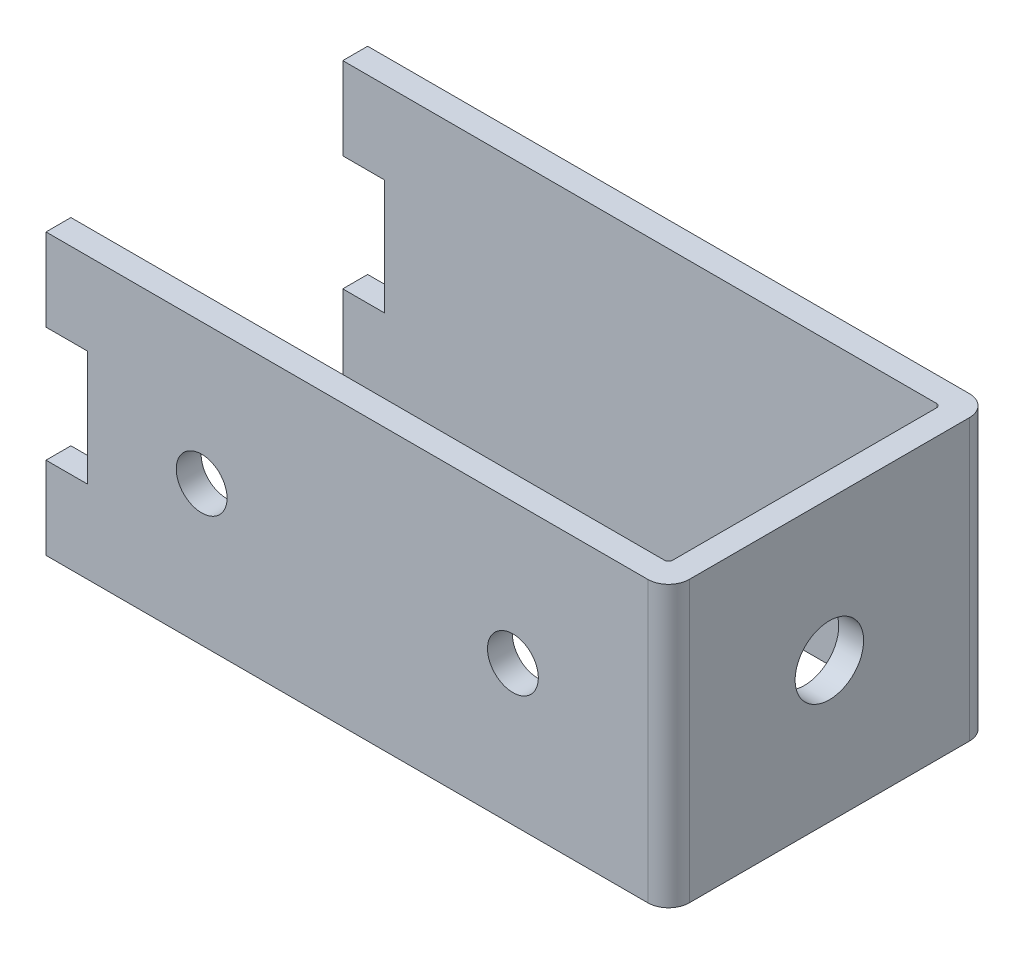
ISO-10303-21;
HEADER;
FILE_DESCRIPTION(('STEP AP214'),'2;1');
FILE_NAME('part.step','',(''),(''),'','','');
FILE_SCHEMA(('AUTOMOTIVE_DESIGN { 1 0 10303 214 1 1 1 1 }'));
ENDSEC;
DATA;
#1=APPLICATION_CONTEXT('core data for automotive mechanical design processes');
#2=APPLICATION_PROTOCOL_DEFINITION('international standard','automotive_design',2000,#1);
#3=PRODUCT_CONTEXT('',#1,'mechanical');
#4=PRODUCT('Part','Part','',(#3));
#5=PRODUCT_RELATED_PRODUCT_CATEGORY('part','',(#4));
#6=PRODUCT_DEFINITION_FORMATION('','',#4);
#7=PRODUCT_DEFINITION_CONTEXT('part definition',#1,'design');
#8=PRODUCT_DEFINITION('design','',#6,#7);
#9=PRODUCT_DEFINITION_SHAPE('','',#8);
#10=(LENGTH_UNIT() NAMED_UNIT(*) SI_UNIT(.MILLI.,.METRE.));
#11=(NAMED_UNIT(*) PLANE_ANGLE_UNIT() SI_UNIT($,.RADIAN.));
#12=(NAMED_UNIT(*) SI_UNIT($,.STERADIAN.) SOLID_ANGLE_UNIT());
#13=UNCERTAINTY_MEASURE_WITH_UNIT(LENGTH_MEASURE(1.E-05),#10,'distance_accuracy_value','');
#14=(GEOMETRIC_REPRESENTATION_CONTEXT(3) GLOBAL_UNCERTAINTY_ASSIGNED_CONTEXT((#13)) GLOBAL_UNIT_ASSIGNED_CONTEXT((#10,
#11,#12)) REPRESENTATION_CONTEXT('',''));
#15=CARTESIAN_POINT('',(0.,0.,0.));
#16=DIRECTION('',(0.,0.,1.));
#17=DIRECTION('',(1.,0.,0.));
#18=AXIS2_PLACEMENT_3D('',#15,#16,#17);
#19=CARTESIAN_POINT('',(-15.,6.75,-7.75));
#20=DIRECTION('',(1.,0.,0.));
#21=DIRECTION('',(0.,0.,-1.));
#22=AXIS2_PLACEMENT_3D('',#19,#20,#21);
#23=PLANE('',#22);
#24=DIRECTION('',(0.,-1.,0.));
#25=VECTOR('',#24,1.);
#26=CARTESIAN_POINT('',(-15.,6.75,-7.75));
#27=LINE('',#26,#25);
#28=CARTESIAN_POINT('',(-15.,6.75,-7.75));
#29=VERTEX_POINT('',#28);
#30=CARTESIAN_POINT('',(-15.,2.775,-7.75));
#31=VERTEX_POINT('',#30);
#32=EDGE_CURVE('E206',#29,#31,#27,.T.);
#33=ORIENTED_EDGE('',*,*,#32,.T.);
#34=DIRECTION('',(0.,0.,1.));
#35=VECTOR('',#34,1.);
#36=CARTESIAN_POINT('',(-15.,2.775,-7.75));
#37=LINE('',#36,#35);
#38=CARTESIAN_POINT('',(-15.,2.775,-6.55));
#39=VERTEX_POINT('',#38);
#40=EDGE_CURVE('E293',#31,#39,#37,.T.);
#41=ORIENTED_EDGE('',*,*,#40,.T.);
#42=DIRECTION('',(0.,1.,0.));
#43=VECTOR('',#42,1.);
#44=CARTESIAN_POINT('',(-15.,-6.75,-6.55));
#45=LINE('',#44,#43);
#46=CARTESIAN_POINT('',(-15.,6.75,-6.55));
#47=VERTEX_POINT('',#46);
#48=EDGE_CURVE('E343',#39,#47,#45,.T.);
#49=ORIENTED_EDGE('',*,*,#48,.T.);
#50=DIRECTION('',(0.,0.,1.));
#51=VECTOR('',#50,1.);
#52=CARTESIAN_POINT('',(-15.,6.75,-7.75));
#53=LINE('',#52,#51);
#54=EDGE_CURVE('E347',#29,#47,#53,.T.);
#55=ORIENTED_EDGE('',*,*,#54,.F.);
#56=EDGE_LOOP('',(#33,#41,#49,#55));
#57=FACE_BOUND('',#56,.T.);
#58=ADVANCED_FACE('F38',(#57),#23,.F.);
#59=DIRECTION('',(0.,1.,0.));
#60=VECTOR('',#59,1.);
#61=CARTESIAN_POINT('',(-15.,-6.75,6.55));
#62=LINE('',#61,#60);
#63=CARTESIAN_POINT('',(-15.,2.775,6.55));
#64=VERTEX_POINT('',#63);
#65=CARTESIAN_POINT('',(-15.,6.75,6.55));
#66=VERTEX_POINT('',#65);
#67=EDGE_CURVE('E338',#64,#66,#62,.T.);
#68=ORIENTED_EDGE('',*,*,#67,.F.);
#69=CARTESIAN_POINT('',(-15.,2.775,7.75));
#70=VERTEX_POINT('',#69);
#71=EDGE_CURVE('E289',#64,#70,#37,.T.);
#72=ORIENTED_EDGE('',*,*,#71,.T.);
#73=DIRECTION('',(0.,-1.,0.));
#74=VECTOR('',#73,1.);
#75=CARTESIAN_POINT('',(-15.,6.75,7.75));
#76=LINE('',#75,#74);
#77=CARTESIAN_POINT('',(-15.,6.75,7.75));
#78=VERTEX_POINT('',#77);
#79=EDGE_CURVE('E205',#78,#70,#76,.T.);
#80=ORIENTED_EDGE('',*,*,#79,.F.);
#81=EDGE_CURVE('E352',#66,#78,#53,.T.);
#82=ORIENTED_EDGE('',*,*,#81,.F.);
#83=EDGE_LOOP('',(#68,#72,#80,#82));
#84=FACE_BOUND('',#83,.T.);
#85=ADVANCED_FACE('F389',(#84),#23,.F.);
#86=CARTESIAN_POINT('',(-15.,-6.75,-6.55));
#87=VERTEX_POINT('',#86);
#88=CARTESIAN_POINT('',(-15.,-2.775,-6.55));
#89=VERTEX_POINT('',#88);
#90=EDGE_CURVE('E339',#87,#89,#45,.T.);
#91=ORIENTED_EDGE('',*,*,#90,.T.);
#92=DIRECTION('',(0.,0.,1.));
#93=VECTOR('',#92,1.);
#94=CARTESIAN_POINT('',(-15.,-2.775,-7.75));
#95=LINE('',#94,#93);
#96=CARTESIAN_POINT('',(-15.,-2.775,-7.75));
#97=VERTEX_POINT('',#96);
#98=EDGE_CURVE('E54',#97,#89,#95,.T.);
#99=ORIENTED_EDGE('',*,*,#98,.F.);
#100=CARTESIAN_POINT('',(-15.,-6.75,-7.75));
#101=VERTEX_POINT('',#100);
#102=EDGE_CURVE('E214',#97,#101,#27,.T.);
#103=ORIENTED_EDGE('',*,*,#102,.T.);
#104=DIRECTION('',(0.,0.,1.));
#105=VECTOR('',#104,1.);
#106=CARTESIAN_POINT('',(-15.,-6.75,-7.75));
#107=LINE('',#106,#105);
#108=EDGE_CURVE('E362',#101,#87,#107,.T.);
#109=ORIENTED_EDGE('',*,*,#108,.T.);
#110=EDGE_LOOP('',(#91,#99,#103,#109));
#111=FACE_BOUND('',#110,.T.);
#112=ADVANCED_FACE('F444',(#111),#23,.F.);
#113=CARTESIAN_POINT('',(-15.,-2.775,7.75));
#114=VERTEX_POINT('',#113);
#115=CARTESIAN_POINT('',(-15.,-6.75,7.75));
#116=VERTEX_POINT('',#115);
#117=EDGE_CURVE('E192',#114,#116,#76,.T.);
#118=ORIENTED_EDGE('',*,*,#117,.F.);
#119=CARTESIAN_POINT('',(-15.,-2.775,6.55));
#120=VERTEX_POINT('',#119);
#121=EDGE_CURVE('E174',#120,#114,#95,.T.);
#122=ORIENTED_EDGE('',*,*,#121,.F.);
#123=CARTESIAN_POINT('',(-15.,-6.75,6.55));
#124=VERTEX_POINT('',#123);
#125=EDGE_CURVE('E344',#124,#120,#62,.T.);
#126=ORIENTED_EDGE('',*,*,#125,.F.);
#127=EDGE_CURVE('E202',#124,#116,#107,.T.);
#128=ORIENTED_EDGE('',*,*,#127,.T.);
#129=EDGE_LOOP('',(#118,#122,#126,#128));
#130=FACE_BOUND('',#129,.T.);
#131=ADVANCED_FACE('F200',(#130),#23,.F.);
#132=CARTESIAN_POINT('',(-15.,6.75,7.75));
#133=DIRECTION('',(0.,0.,-1.));
#134=DIRECTION('',(-1.,0.,0.));
#135=AXIS2_PLACEMENT_3D('',#132,#133,#134);
#136=PLANE('',#135);
#137=CARTESIAN_POINT('',(7.50000000000001,0.,7.75));
#138=DIRECTION('',(0.,0.,1.));
#139=DIRECTION('',(1.,0.,0.));
#140=AXIS2_PLACEMENT_3D('',#137,#138,#139);
#141=CIRCLE('',#140,1.225);
#142=CARTESIAN_POINT('',(8.725,0.,7.75));
#143=VERTEX_POINT('',#142);
#144=EDGE_CURVE('E410',#143,#143,#141,.T.);
#145=ORIENTED_EDGE('',*,*,#144,.F.);
#146=EDGE_LOOP('',(#145));
#147=FACE_BOUND('',#146,.T.);
#148=CARTESIAN_POINT('',(-7.49999999999999,0.,7.75));
#149=DIRECTION('',(0.,0.,1.));
#150=DIRECTION('',(1.,0.,0.));
#151=AXIS2_PLACEMENT_3D('',#148,#149,#150);
#152=CIRCLE('',#151,1.225);
#153=CARTESIAN_POINT('',(-6.27499999999999,0.,7.75));
#154=VERTEX_POINT('',#153);
#155=EDGE_CURVE('E198',#154,#154,#152,.T.);
#156=ORIENTED_EDGE('',*,*,#155,.F.);
#157=EDGE_LOOP('',(#156));
#158=FACE_BOUND('',#157,.T.);
#159=ORIENTED_EDGE('',*,*,#79,.T.);
#160=DIRECTION('',(-1.,0.,0.));
#161=VECTOR('',#160,1.);
#162=CARTESIAN_POINT('',(-15.,2.775,7.75));
#163=LINE('',#162,#161);
#164=CARTESIAN_POINT('',(-13.,2.775,7.75));
#165=VERTEX_POINT('',#164);
#166=EDGE_CURVE('E406',#165,#70,#163,.T.);
#167=ORIENTED_EDGE('',*,*,#166,.F.);
#168=DIRECTION('',(0.,1.,0.));
#169=VECTOR('',#168,1.);
#170=CARTESIAN_POINT('',(-13.,2.775,7.75));
#171=LINE('',#170,#169);
#172=CARTESIAN_POINT('',(-13.,-2.775,7.75));
#173=VERTEX_POINT('',#172);
#174=EDGE_CURVE('E196',#173,#165,#171,.T.);
#175=ORIENTED_EDGE('',*,*,#174,.F.);
#176=DIRECTION('',(1.,0.,0.));
#177=VECTOR('',#176,1.);
#178=CARTESIAN_POINT('',(-15.,-2.775,7.75));
#179=LINE('',#178,#177);
#180=EDGE_CURVE('E177',#114,#173,#179,.T.);
#181=ORIENTED_EDGE('',*,*,#180,.F.);
#182=ORIENTED_EDGE('',*,*,#117,.T.);
#183=DIRECTION('',(1.,0.,0.));
#184=VECTOR('',#183,1.);
#185=CARTESIAN_POINT('',(-15.,-6.75,7.75));
#186=LINE('',#185,#184);
#187=CARTESIAN_POINT('',(14.,-6.75,7.75));
#188=VERTEX_POINT('',#187);
#189=EDGE_CURVE('E366',#116,#188,#186,.T.);
#190=ORIENTED_EDGE('',*,*,#189,.T.);
#191=DIRECTION('',(0.,-1.,0.));
#192=VECTOR('',#191,1.);
#193=CARTESIAN_POINT('',(14.,6.75,7.75));
#194=LINE('',#193,#192);
#195=CARTESIAN_POINT('',(14.,6.75,7.75));
#196=VERTEX_POINT('',#195);
#197=EDGE_CURVE('E230',#188,#196,#194,.F.);
#198=ORIENTED_EDGE('',*,*,#197,.T.);
#199=DIRECTION('',(1.,0.,0.));
#200=VECTOR('',#199,1.);
#201=CARTESIAN_POINT('',(-15.,6.75,7.75));
#202=LINE('',#201,#200);
#203=EDGE_CURVE('E351',#78,#196,#202,.T.);
#204=ORIENTED_EDGE('',*,*,#203,.F.);
#205=EDGE_LOOP('',(#159,#167,#175,#181,#182,#190,#198,#204));
#206=FACE_BOUND('',#205,.T.);
#207=ADVANCED_FACE('F190',(#147,#158,#206),#136,.F.);
#208=CARTESIAN_POINT('',(15.,6.75,-7.75));
#209=DIRECTION('',(-1.,0.,0.));
#210=DIRECTION('',(0.,0.,1.));
#211=AXIS2_PLACEMENT_3D('',#208,#209,#210);
#212=PLANE('',#211);
#213=CARTESIAN_POINT('',(15.,0.,0.));
#214=DIRECTION('',(1.,0.,0.));
#215=DIRECTION('',(0.,0.,-1.));
#216=AXIS2_PLACEMENT_3D('',#213,#214,#215);
#217=CIRCLE('',#216,1.65);
#218=CARTESIAN_POINT('',(15.,0.,-1.65));
#219=VERTEX_POINT('',#218);
#220=EDGE_CURVE('E308',#219,#219,#217,.T.);
#221=ORIENTED_EDGE('',*,*,#220,.F.);
#222=EDGE_LOOP('',(#221));
#223=FACE_BOUND('',#222,.T.);
#224=DIRECTION('',(0.,0.,-1.));
#225=VECTOR('',#224,1.);
#226=CARTESIAN_POINT('',(15.,6.75,-7.75));
#227=LINE('',#226,#225);
#228=CARTESIAN_POINT('',(15.,6.75,6.75));
#229=VERTEX_POINT('',#228);
#230=CARTESIAN_POINT('',(15.,6.75,-6.75));
#231=VERTEX_POINT('',#230);
#232=EDGE_CURVE('E356',#229,#231,#227,.T.);
#233=ORIENTED_EDGE('',*,*,#232,.F.);
#234=DIRECTION('',(0.,-1.,0.));
#235=VECTOR('',#234,1.);
#236=CARTESIAN_POINT('',(15.,6.75,6.75));
#237=LINE('',#236,#235);
#238=CARTESIAN_POINT('',(15.,-6.75,6.75));
#239=VERTEX_POINT('',#238);
#240=EDGE_CURVE('E220',#229,#239,#237,.T.);
#241=ORIENTED_EDGE('',*,*,#240,.T.);
#242=DIRECTION('',(0.,0.,-1.));
#243=VECTOR('',#242,1.);
#244=CARTESIAN_POINT('',(15.,-6.75,-7.75));
#245=LINE('',#244,#243);
#246=CARTESIAN_POINT('',(15.,-6.75,-6.75));
#247=VERTEX_POINT('',#246);
#248=EDGE_CURVE('E368',#239,#247,#245,.T.);
#249=ORIENTED_EDGE('',*,*,#248,.T.);
#250=DIRECTION('',(0.,-1.,0.));
#251=VECTOR('',#250,1.);
#252=CARTESIAN_POINT('',(15.,6.75,-6.75));
#253=LINE('',#252,#251);
#254=EDGE_CURVE('E211',#247,#231,#253,.F.);
#255=ORIENTED_EDGE('',*,*,#254,.T.);
#256=EDGE_LOOP('',(#233,#241,#249,#255));
#257=FACE_BOUND('',#256,.T.);
#258=ADVANCED_FACE('F468',(#223,#257),#212,.F.);
#259=CARTESIAN_POINT('',(-15.,6.75,-7.75));
#260=DIRECTION('',(0.,0.,1.));
#261=DIRECTION('',(1.,0.,0.));
#262=AXIS2_PLACEMENT_3D('',#259,#260,#261);
#263=PLANE('',#262);
#264=DIRECTION('',(0.,1.,0.));
#265=VECTOR('',#264,1.);
#266=CARTESIAN_POINT('',(-13.,2.775,-7.75));
#267=LINE('',#266,#265);
#268=CARTESIAN_POINT('',(-13.,-2.775,-7.75));
#269=VERTEX_POINT('',#268);
#270=CARTESIAN_POINT('',(-13.,2.775,-7.75));
#271=VERTEX_POINT('',#270);
#272=EDGE_CURVE('E431',#269,#271,#267,.T.);
#273=ORIENTED_EDGE('',*,*,#272,.T.);
#274=DIRECTION('',(-1.,0.,0.));
#275=VECTOR('',#274,1.);
#276=CARTESIAN_POINT('',(-15.,2.775,-7.75));
#277=LINE('',#276,#275);
#278=EDGE_CURVE('E186',#271,#31,#277,.T.);
#279=ORIENTED_EDGE('',*,*,#278,.T.);
#280=ORIENTED_EDGE('',*,*,#32,.F.);
#281=DIRECTION('',(-1.,0.,0.));
#282=VECTOR('',#281,1.);
#283=CARTESIAN_POINT('',(-15.,6.75,-7.75));
#284=LINE('',#283,#282);
#285=CARTESIAN_POINT('',(14.,6.75,-7.75));
#286=VERTEX_POINT('',#285);
#287=EDGE_CURVE('E359',#286,#29,#284,.T.);
#288=ORIENTED_EDGE('',*,*,#287,.F.);
#289=DIRECTION('',(0.,-1.,0.));
#290=VECTOR('',#289,1.);
#291=CARTESIAN_POINT('',(14.,6.75,-7.75));
#292=LINE('',#291,#290);
#293=CARTESIAN_POINT('',(14.,-6.75,-7.75));
#294=VERTEX_POINT('',#293);
#295=EDGE_CURVE('E239',#286,#294,#292,.T.);
#296=ORIENTED_EDGE('',*,*,#295,.T.);
#297=DIRECTION('',(-1.,0.,0.));
#298=VECTOR('',#297,1.);
#299=CARTESIAN_POINT('',(-15.,-6.75,-7.75));
#300=LINE('',#299,#298);
#301=EDGE_CURVE('E371',#294,#101,#300,.T.);
#302=ORIENTED_EDGE('',*,*,#301,.T.);
#303=ORIENTED_EDGE('',*,*,#102,.F.);
#304=DIRECTION('',(1.,0.,0.));
#305=VECTOR('',#304,1.);
#306=CARTESIAN_POINT('',(-15.,-2.775,-7.75));
#307=LINE('',#306,#305);
#308=EDGE_CURVE('E427',#97,#269,#307,.T.);
#309=ORIENTED_EDGE('',*,*,#308,.T.);
#310=EDGE_LOOP('',(#273,#279,#280,#288,#296,#302,#303,#309));
#311=FACE_BOUND('',#310,.T.);
#312=ADVANCED_FACE('F435',(#311),#263,.F.);
#313=CARTESIAN_POINT('',(0.,6.75,0.));
#314=DIRECTION('',(0.,1.,0.));
#315=DIRECTION('',(0.,0.,1.));
#316=AXIS2_PLACEMENT_3D('',#313,#314,#315);
#317=PLANE('',#316);
#318=ORIENTED_EDGE('',*,*,#203,.T.);
#319=CARTESIAN_POINT('',(14.,6.75,6.75));
#320=DIRECTION('',(0.,1.,0.));
#321=DIRECTION('',(0.,0.,1.));
#322=AXIS2_PLACEMENT_3D('',#319,#320,#321);
#323=CIRCLE('',#322,1.);
#324=EDGE_CURVE('E236',#196,#229,#323,.T.);
#325=ORIENTED_EDGE('',*,*,#324,.T.);
#326=ORIENTED_EDGE('',*,*,#232,.T.);
#327=CARTESIAN_POINT('',(14.,6.75,-6.75));
#328=DIRECTION('',(0.,1.,0.));
#329=DIRECTION('',(0.,0.,1.));
#330=AXIS2_PLACEMENT_3D('',#327,#328,#329);
#331=CIRCLE('',#330,1.);
#332=EDGE_CURVE('E233',#231,#286,#331,.T.);
#333=ORIENTED_EDGE('',*,*,#332,.T.);
#334=ORIENTED_EDGE('',*,*,#287,.T.);
#335=ORIENTED_EDGE('',*,*,#54,.T.);
#336=DIRECTION('',(-1.,0.,0.));
#337=VECTOR('',#336,1.);
#338=CARTESIAN_POINT('',(-15.,6.75,-6.55));
#339=LINE('',#338,#337);
#340=CARTESIAN_POINT('',(13.6,6.75,-6.55));
#341=VERTEX_POINT('',#340);
#342=EDGE_CURVE('E323',#341,#47,#339,.T.);
#343=ORIENTED_EDGE('',*,*,#342,.F.);
#344=CARTESIAN_POINT('',(13.6,6.75,-6.35));
#345=DIRECTION('',(0.,1.,0.));
#346=DIRECTION('',(0.,0.,1.));
#347=AXIS2_PLACEMENT_3D('',#344,#345,#346);
#348=CIRCLE('',#347,0.2);
#349=CARTESIAN_POINT('',(13.8,6.75,-6.35));
#350=VERTEX_POINT('',#349);
#351=EDGE_CURVE('E263',#341,#350,#348,.F.);
#352=ORIENTED_EDGE('',*,*,#351,.T.);
#353=DIRECTION('',(0.,0.,-1.));
#354=VECTOR('',#353,1.);
#355=CARTESIAN_POINT('',(13.8,6.75,6.54999999999999));
#356=LINE('',#355,#354);
#357=CARTESIAN_POINT('',(13.8,6.75,6.34999999999999));
#358=VERTEX_POINT('',#357);
#359=EDGE_CURVE('E319',#358,#350,#356,.T.);
#360=ORIENTED_EDGE('',*,*,#359,.F.);
#361=CARTESIAN_POINT('',(13.6,6.75,6.34999999999999));
#362=DIRECTION('',(0.,1.,0.));
#363=DIRECTION('',(0.,0.,1.));
#364=AXIS2_PLACEMENT_3D('',#361,#362,#363);
#365=CIRCLE('',#364,0.2);
#366=CARTESIAN_POINT('',(13.6,6.75,6.54999999999999));
#367=VERTEX_POINT('',#366);
#368=EDGE_CURVE('E257',#358,#367,#365,.F.);
#369=ORIENTED_EDGE('',*,*,#368,.T.);
#370=DIRECTION('',(1.,0.,0.));
#371=VECTOR('',#370,1.);
#372=CARTESIAN_POINT('',(-15.,6.75,6.55));
#373=LINE('',#372,#371);
#374=EDGE_CURVE('E316',#66,#367,#373,.T.);
#375=ORIENTED_EDGE('',*,*,#374,.F.);
#376=ORIENTED_EDGE('',*,*,#81,.T.);
#377=EDGE_LOOP('',(#318,#325,#326,#333,#334,#335,#343,#352,#360,#369,#375,#376));
#378=FACE_BOUND('',#377,.T.);
#379=ADVANCED_FACE('F383',(#378),#317,.T.);
#380=CARTESIAN_POINT('',(0.,-6.75,0.));
#381=DIRECTION('',(0.,1.,0.));
#382=DIRECTION('',(0.,0.,1.));
#383=AXIS2_PLACEMENT_3D('',#380,#381,#382);
#384=PLANE('',#383);
#385=ORIENTED_EDGE('',*,*,#248,.F.);
#386=CARTESIAN_POINT('',(14.,-6.75,6.75));
#387=DIRECTION('',(0.,1.,0.));
#388=DIRECTION('',(0.,0.,1.));
#389=AXIS2_PLACEMENT_3D('',#386,#387,#388);
#390=CIRCLE('',#389,1.);
#391=EDGE_CURVE('E227',#239,#188,#390,.F.);
#392=ORIENTED_EDGE('',*,*,#391,.T.);
#393=ORIENTED_EDGE('',*,*,#189,.F.);
#394=ORIENTED_EDGE('',*,*,#127,.F.);
#395=DIRECTION('',(1.,0.,0.));
#396=VECTOR('',#395,1.);
#397=CARTESIAN_POINT('',(-15.,-6.75,6.55));
#398=LINE('',#397,#396);
#399=CARTESIAN_POINT('',(13.6,-6.75,6.54999999999999));
#400=VERTEX_POINT('',#399);
#401=EDGE_CURVE('E327',#124,#400,#398,.T.);
#402=ORIENTED_EDGE('',*,*,#401,.T.);
#403=CARTESIAN_POINT('',(13.6,-6.75,6.34999999999999));
#404=DIRECTION('',(0.,1.,0.));
#405=DIRECTION('',(0.,0.,1.));
#406=AXIS2_PLACEMENT_3D('',#403,#404,#405);
#407=CIRCLE('',#406,0.2);
#408=CARTESIAN_POINT('',(13.8,-6.75,6.34999999999999));
#409=VERTEX_POINT('',#408);
#410=EDGE_CURVE('E260',#400,#409,#407,.T.);
#411=ORIENTED_EDGE('',*,*,#410,.T.);
#412=DIRECTION('',(0.,0.,-1.));
#413=VECTOR('',#412,1.);
#414=CARTESIAN_POINT('',(13.8,-6.75,6.54999999999999));
#415=LINE('',#414,#413);
#416=CARTESIAN_POINT('',(13.8,-6.75,-6.35));
#417=VERTEX_POINT('',#416);
#418=EDGE_CURVE('E331',#409,#417,#415,.T.);
#419=ORIENTED_EDGE('',*,*,#418,.T.);
#420=CARTESIAN_POINT('',(13.6,-6.75,-6.35));
#421=DIRECTION('',(0.,1.,0.));
#422=DIRECTION('',(0.,0.,1.));
#423=AXIS2_PLACEMENT_3D('',#420,#421,#422);
#424=CIRCLE('',#423,0.2);
#425=CARTESIAN_POINT('',(13.6,-6.75,-6.55));
#426=VERTEX_POINT('',#425);
#427=EDGE_CURVE('E266',#417,#426,#424,.T.);
#428=ORIENTED_EDGE('',*,*,#427,.T.);
#429=DIRECTION('',(-1.,0.,0.));
#430=VECTOR('',#429,1.);
#431=CARTESIAN_POINT('',(-15.,-6.75,-6.55));
#432=LINE('',#431,#430);
#433=EDGE_CURVE('E335',#426,#87,#432,.T.);
#434=ORIENTED_EDGE('',*,*,#433,.T.);
#435=ORIENTED_EDGE('',*,*,#108,.F.);
#436=ORIENTED_EDGE('',*,*,#301,.F.);
#437=CARTESIAN_POINT('',(14.,-6.75,-6.75));
#438=DIRECTION('',(0.,1.,0.));
#439=DIRECTION('',(0.,0.,1.));
#440=AXIS2_PLACEMENT_3D('',#437,#438,#439);
#441=CIRCLE('',#440,1.);
#442=EDGE_CURVE('E224',#294,#247,#441,.F.);
#443=ORIENTED_EDGE('',*,*,#442,.T.);
#444=EDGE_LOOP('',(#385,#392,#393,#394,#402,#411,#419,#428,#434,#435,#436,#443));
#445=FACE_BOUND('',#444,.T.);
#446=ADVANCED_FACE('F447',(#445),#384,.F.);
#447=CARTESIAN_POINT('',(-15.,-6.75,-6.55));
#448=DIRECTION('',(0.,0.,-1.));
#449=DIRECTION('',(-1.,0.,0.));
#450=AXIS2_PLACEMENT_3D('',#447,#448,#449);
#451=PLANE('',#450);
#452=ORIENTED_EDGE('',*,*,#48,.F.);
#453=DIRECTION('',(1.,0.,0.));
#454=VECTOR('',#453,1.);
#455=CARTESIAN_POINT('',(-15.,2.775,-6.55));
#456=LINE('',#455,#454);
#457=CARTESIAN_POINT('',(-13.,2.775,-6.55));
#458=VERTEX_POINT('',#457);
#459=EDGE_CURVE('E304',#39,#458,#456,.T.);
#460=ORIENTED_EDGE('',*,*,#459,.T.);
#461=DIRECTION('',(0.,-1.,0.));
#462=VECTOR('',#461,1.);
#463=CARTESIAN_POINT('',(-13.,-6.75,-6.55));
#464=LINE('',#463,#462);
#465=CARTESIAN_POINT('',(-13.,-2.775,-6.55));
#466=VERTEX_POINT('',#465);
#467=EDGE_CURVE('E300',#458,#466,#464,.T.);
#468=ORIENTED_EDGE('',*,*,#467,.T.);
#469=DIRECTION('',(-1.,0.,0.));
#470=VECTOR('',#469,1.);
#471=CARTESIAN_POINT('',(-15.,-2.775,-6.55));
#472=LINE('',#471,#470);
#473=EDGE_CURVE('E297',#466,#89,#472,.T.);
#474=ORIENTED_EDGE('',*,*,#473,.T.);
#475=ORIENTED_EDGE('',*,*,#90,.F.);
#476=ORIENTED_EDGE('',*,*,#433,.F.);
#477=DIRECTION('',(0.,1.,0.));
#478=VECTOR('',#477,1.);
#479=CARTESIAN_POINT('',(13.6,6.75,-6.55));
#480=LINE('',#479,#478);
#481=EDGE_CURVE('E253',#426,#341,#480,.T.);
#482=ORIENTED_EDGE('',*,*,#481,.T.);
#483=ORIENTED_EDGE('',*,*,#342,.T.);
#484=EDGE_LOOP('',(#452,#460,#468,#474,#475,#476,#482,#483));
#485=FACE_BOUND('',#484,.T.);
#486=ADVANCED_FACE('F402',(#485),#451,.F.);
#487=CARTESIAN_POINT('',(13.8,-6.75,6.54999999999999));
#488=DIRECTION('',(1.,0.,0.));
#489=DIRECTION('',(0.,0.,-1.));
#490=AXIS2_PLACEMENT_3D('',#487,#488,#489);
#491=PLANE('',#490);
#492=CARTESIAN_POINT('',(13.8,0.,0.));
#493=DIRECTION('',(1.,0.,0.));
#494=DIRECTION('',(0.,0.,-1.));
#495=AXIS2_PLACEMENT_3D('',#492,#493,#494);
#496=CIRCLE('',#495,1.65);
#497=CARTESIAN_POINT('',(13.8,0.,-1.65));
#498=VERTEX_POINT('',#497);
#499=EDGE_CURVE('E312',#498,#498,#496,.F.);
#500=ORIENTED_EDGE('',*,*,#499,.F.);
#501=EDGE_LOOP('',(#500));
#502=FACE_BOUND('',#501,.T.);
#503=ORIENTED_EDGE('',*,*,#418,.F.);
#504=DIRECTION('',(0.,1.,0.));
#505=VECTOR('',#504,1.);
#506=CARTESIAN_POINT('',(13.8,6.75,6.34999999999999));
#507=LINE('',#506,#505);
#508=EDGE_CURVE('E246',#409,#358,#507,.T.);
#509=ORIENTED_EDGE('',*,*,#508,.T.);
#510=ORIENTED_EDGE('',*,*,#359,.T.);
#511=DIRECTION('',(0.,1.,0.));
#512=VECTOR('',#511,1.);
#513=CARTESIAN_POINT('',(13.8,-6.75,-6.35));
#514=LINE('',#513,#512);
#515=EDGE_CURVE('E243',#350,#417,#514,.F.);
#516=ORIENTED_EDGE('',*,*,#515,.T.);
#517=EDGE_LOOP('',(#503,#509,#510,#516));
#518=FACE_BOUND('',#517,.T.);
#519=ADVANCED_FACE('F455',(#502,#518),#491,.F.);
#520=CARTESIAN_POINT('',(-15.,-6.75,6.55));
#521=DIRECTION('',(0.,0.,1.));
#522=DIRECTION('',(1.,0.,0.));
#523=AXIS2_PLACEMENT_3D('',#520,#521,#522);
#524=PLANE('',#523);
#525=CARTESIAN_POINT('',(7.50000000000001,0.,6.54999999999999));
#526=DIRECTION('',(0.,0.,1.));
#527=DIRECTION('',(1.,0.,0.));
#528=AXIS2_PLACEMENT_3D('',#525,#526,#527);
#529=CIRCLE('',#528,1.225);
#530=CARTESIAN_POINT('',(8.725,0.,6.54999999999999));
#531=VERTEX_POINT('',#530);
#532=EDGE_CURVE('E413',#531,#531,#529,.F.);
#533=ORIENTED_EDGE('',*,*,#532,.F.);
#534=EDGE_LOOP('',(#533));
#535=FACE_BOUND('',#534,.T.);
#536=CARTESIAN_POINT('',(-7.49999999999999,0.,6.55));
#537=DIRECTION('',(0.,0.,1.));
#538=DIRECTION('',(1.,0.,0.));
#539=AXIS2_PLACEMENT_3D('',#536,#537,#538);
#540=CIRCLE('',#539,1.225);
#541=CARTESIAN_POINT('',(-6.27499999999999,0.,6.55));
#542=VERTEX_POINT('',#541);
#543=EDGE_CURVE('E412',#542,#542,#540,.F.);
#544=ORIENTED_EDGE('',*,*,#543,.F.);
#545=EDGE_LOOP('',(#544));
#546=FACE_BOUND('',#545,.T.);
#547=DIRECTION('',(0.,1.,0.));
#548=VECTOR('',#547,1.);
#549=CARTESIAN_POINT('',(-13.,-6.75,6.55));
#550=LINE('',#549,#548);
#551=CARTESIAN_POINT('',(-13.,-2.775,6.55));
#552=VERTEX_POINT('',#551);
#553=CARTESIAN_POINT('',(-13.,2.775,6.55));
#554=VERTEX_POINT('',#553);
#555=EDGE_CURVE('E47',#552,#554,#550,.T.);
#556=ORIENTED_EDGE('',*,*,#555,.T.);
#557=DIRECTION('',(-1.,0.,0.));
#558=VECTOR('',#557,1.);
#559=CARTESIAN_POINT('',(-15.,2.775,6.55));
#560=LINE('',#559,#558);
#561=EDGE_CURVE('E11',#554,#64,#560,.T.);
#562=ORIENTED_EDGE('',*,*,#561,.T.);
#563=ORIENTED_EDGE('',*,*,#67,.T.);
#564=ORIENTED_EDGE('',*,*,#374,.T.);
#565=DIRECTION('',(0.,1.,0.));
#566=VECTOR('',#565,1.);
#567=CARTESIAN_POINT('',(13.6,-6.75,6.54999999999999));
#568=LINE('',#567,#566);
#569=EDGE_CURVE('E250',#367,#400,#568,.F.);
#570=ORIENTED_EDGE('',*,*,#569,.T.);
#571=ORIENTED_EDGE('',*,*,#401,.F.);
#572=ORIENTED_EDGE('',*,*,#125,.T.);
#573=DIRECTION('',(1.,0.,0.));
#574=VECTOR('',#573,1.);
#575=CARTESIAN_POINT('',(-15.,-2.775,6.55));
#576=LINE('',#575,#574);
#577=EDGE_CURVE('E180',#120,#552,#576,.T.);
#578=ORIENTED_EDGE('',*,*,#577,.T.);
#579=EDGE_LOOP('',(#556,#562,#563,#564,#570,#571,#572,#578));
#580=FACE_BOUND('',#579,.T.);
#581=ADVANCED_FACE('F274',(#535,#546,#580),#524,.F.);
#582=CARTESIAN_POINT('',(-15.001,0.,0.));
#583=DIRECTION('',(1.,0.,0.));
#584=DIRECTION('',(0.,0.,-1.));
#585=AXIS2_PLACEMENT_3D('',#582,#583,#584);
#586=CYLINDRICAL_SURFACE('',#585,1.65);
#587=CARTESIAN_POINT('',(15.,0.,-1.65));
#588=CARTESIAN_POINT('',(14.9875,0.,-1.65));
#589=CARTESIAN_POINT('',(14.975,0.,-1.65));
#590=CARTESIAN_POINT('',(14.95,0.,-1.65));
#591=CARTESIAN_POINT('',(14.9375,0.,-1.65));
#592=CARTESIAN_POINT('',(14.9125,0.,-1.65));
#593=CARTESIAN_POINT('',(14.9,0.,-1.65));
#594=CARTESIAN_POINT('',(14.875,0.,-1.65));
#595=CARTESIAN_POINT('',(14.8625,0.,-1.65));
#596=CARTESIAN_POINT('',(14.8375,0.,-1.65));
#597=CARTESIAN_POINT('',(14.825,0.,-1.65));
#598=CARTESIAN_POINT('',(14.8,0.,-1.65));
#599=CARTESIAN_POINT('',(14.7875,0.,-1.65));
#600=CARTESIAN_POINT('',(14.7625,0.,-1.65));
#601=CARTESIAN_POINT('',(14.75,0.,-1.65));
#602=CARTESIAN_POINT('',(14.725,0.,-1.65));
#603=CARTESIAN_POINT('',(14.7125,0.,-1.65));
#604=CARTESIAN_POINT('',(14.6875,0.,-1.65));
#605=CARTESIAN_POINT('',(14.675,0.,-1.65));
#606=CARTESIAN_POINT('',(14.65,0.,-1.65));
#607=CARTESIAN_POINT('',(14.6375,0.,-1.65));
#608=CARTESIAN_POINT('',(14.6125,0.,-1.65));
#609=CARTESIAN_POINT('',(14.6,0.,-1.65));
#610=CARTESIAN_POINT('',(14.575,0.,-1.65));
#611=CARTESIAN_POINT('',(14.5625,0.,-1.65));
#612=CARTESIAN_POINT('',(14.5375,0.,-1.65));
#613=CARTESIAN_POINT('',(14.525,0.,-1.65));
#614=CARTESIAN_POINT('',(14.5,0.,-1.65));
#615=CARTESIAN_POINT('',(14.4875,0.,-1.65));
#616=CARTESIAN_POINT('',(14.4625,0.,-1.65));
#617=CARTESIAN_POINT('',(14.45,0.,-1.65));
#618=CARTESIAN_POINT('',(14.425,0.,-1.65));
#619=CARTESIAN_POINT('',(14.4125,0.,-1.65));
#620=CARTESIAN_POINT('',(14.3875,0.,-1.65));
#621=CARTESIAN_POINT('',(14.375,0.,-1.65));
#622=CARTESIAN_POINT('',(14.35,0.,-1.65));
#623=CARTESIAN_POINT('',(14.3375,0.,-1.65));
#624=CARTESIAN_POINT('',(14.3125,0.,-1.65));
#625=CARTESIAN_POINT('',(14.3,0.,-1.65));
#626=CARTESIAN_POINT('',(14.275,0.,-1.65));
#627=CARTESIAN_POINT('',(14.2625,0.,-1.65));
#628=CARTESIAN_POINT('',(14.2375,0.,-1.65));
#629=CARTESIAN_POINT('',(14.225,0.,-1.65));
#630=CARTESIAN_POINT('',(14.2,0.,-1.65));
#631=CARTESIAN_POINT('',(14.1875,0.,-1.65));
#632=CARTESIAN_POINT('',(14.1625,0.,-1.65));
#633=CARTESIAN_POINT('',(14.15,0.,-1.65));
#634=CARTESIAN_POINT('',(14.125,0.,-1.65));
#635=CARTESIAN_POINT('',(14.1125,0.,-1.65));
#636=CARTESIAN_POINT('',(14.0875,0.,-1.65));
#637=CARTESIAN_POINT('',(14.075,0.,-1.65));
#638=CARTESIAN_POINT('',(14.05,0.,-1.65));
#639=CARTESIAN_POINT('',(14.0375,0.,-1.65));
#640=CARTESIAN_POINT('',(14.0125,0.,-1.65));
#641=CARTESIAN_POINT('',(14.,0.,-1.65));
#642=CARTESIAN_POINT('',(13.975,0.,-1.65));
#643=CARTESIAN_POINT('',(13.9625,0.,-1.65));
#644=CARTESIAN_POINT('',(13.9375,0.,-1.65));
#645=CARTESIAN_POINT('',(13.925,0.,-1.65));
#646=CARTESIAN_POINT('',(13.9,0.,-1.65));
#647=CARTESIAN_POINT('',(13.8875,0.,-1.65));
#648=CARTESIAN_POINT('',(13.8625,0.,-1.65));
#649=CARTESIAN_POINT('',(13.85,0.,-1.65));
#650=CARTESIAN_POINT('',(13.825,0.,-1.65));
#651=CARTESIAN_POINT('',(13.8125,0.,-1.65));
#652=CARTESIAN_POINT('',(13.8,0.,-1.65));
#653=B_SPLINE_CURVE_WITH_KNOTS('',3,(#587,#588,#589,#590,#591,#592,#593,#594,#595,#596,#597,
#598,#599,#600,#601,#602,#603,#604,#605,#606,#607,#608,#609,#610,#611,#612,#613,#614,#615,#616,
#617,#618,#619,#620,#621,#622,#623,#624,#625,#626,#627,#628,#629,#630,#631,#632,#633,#634,#635,
#636,#637,#638,#639,#640,#641,#642,#643,#644,#645,#646,#647,#648,#649,#650,#651,#652),
.UNSPECIFIED.,.F.,.F.,(4,2,2,2,2,2,2,2,2,2,2,2,2,2,2,2,2,2,2,2,2,2,2,2,2,2,2,2,2,2,2,2,4),(0.,
0.0374999999999993,0.0749999999999987,0.112500000000001,0.150000000000001,0.1875,0.225,
0.262499999999999,0.300000000000002,0.337500000000001,0.375,0.4125,0.449999999999999,
0.487499999999998,0.525000000000001,0.5625,0.6,0.637499999999999,0.674999999999998,
0.712500000000001,0.750000000000001,0.7875,0.824999999999999,0.862499999999999,
0.899999999999998,0.937500000000001,0.975,1.0125,1.05,1.0875,1.125,1.1625,1.2),.UNSPECIFIED.);
#654=EDGE_CURVE('BSEAM479',#219,#498,#653,.T.);
#655=ORIENTED_EDGE('',*,*,#220,.T.);
#656=ORIENTED_EDGE('',*,*,#499,.T.);
#657=ORIENTED_EDGE('',*,*,#654,.T.);
#658=ORIENTED_EDGE('',*,*,#654,.F.);
#659=EDGE_LOOP('',(#655,#657,#656,#658));
#660=FACE_BOUND('',#659,.T.);
#661=ADVANCED_FACE('F479',(#660),#586,.F.);
#662=CARTESIAN_POINT('',(14.,6.75,6.75));
#663=DIRECTION('',(0.,-1.,0.));
#664=DIRECTION('',(0.,0.,-1.));
#665=AXIS2_PLACEMENT_3D('',#662,#663,#664);
#666=CYLINDRICAL_SURFACE('',#665,1.);
#667=ORIENTED_EDGE('',*,*,#324,.F.);
#668=ORIENTED_EDGE('',*,*,#197,.F.);
#669=ORIENTED_EDGE('',*,*,#391,.F.);
#670=ORIENTED_EDGE('',*,*,#240,.F.);
#671=EDGE_LOOP('',(#667,#668,#669,#670));
#672=FACE_BOUND('',#671,.T.);
#673=ADVANCED_FACE('F463',(#672),#666,.T.);
#674=CARTESIAN_POINT('',(14.,6.75,-6.75));
#675=DIRECTION('',(0.,-1.,0.));
#676=DIRECTION('',(0.,0.,-1.));
#677=AXIS2_PLACEMENT_3D('',#674,#675,#676);
#678=CYLINDRICAL_SURFACE('',#677,1.);
#679=ORIENTED_EDGE('',*,*,#332,.F.);
#680=ORIENTED_EDGE('',*,*,#254,.F.);
#681=ORIENTED_EDGE('',*,*,#442,.F.);
#682=ORIENTED_EDGE('',*,*,#295,.F.);
#683=EDGE_LOOP('',(#679,#680,#681,#682));
#684=FACE_BOUND('',#683,.T.);
#685=ADVANCED_FACE('F471',(#684),#678,.T.);
#686=CARTESIAN_POINT('',(13.6,-6.75,6.34999999999999));
#687=DIRECTION('',(0.,-1.,0.));
#688=DIRECTION('',(0.,0.,-1.));
#689=AXIS2_PLACEMENT_3D('',#686,#687,#688);
#690=CYLINDRICAL_SURFACE('',#689,0.2);
#691=ORIENTED_EDGE('',*,*,#410,.F.);
#692=ORIENTED_EDGE('',*,*,#569,.F.);
#693=ORIENTED_EDGE('',*,*,#368,.F.);
#694=ORIENTED_EDGE('',*,*,#508,.F.);
#695=EDGE_LOOP('',(#691,#692,#693,#694));
#696=FACE_BOUND('',#695,.T.);
#697=ADVANCED_FACE('F459',(#696),#690,.F.);
#698=CARTESIAN_POINT('',(13.6,-6.75,-6.35));
#699=DIRECTION('',(0.,-1.,0.));
#700=DIRECTION('',(0.,0.,-1.));
#701=AXIS2_PLACEMENT_3D('',#698,#699,#700);
#702=CYLINDRICAL_SURFACE('',#701,0.2);
#703=ORIENTED_EDGE('',*,*,#427,.F.);
#704=ORIENTED_EDGE('',*,*,#515,.F.);
#705=ORIENTED_EDGE('',*,*,#351,.F.);
#706=ORIENTED_EDGE('',*,*,#481,.F.);
#707=EDGE_LOOP('',(#703,#704,#705,#706));
#708=FACE_BOUND('',#707,.T.);
#709=ADVANCED_FACE('F40',(#708),#702,.F.);
#710=CARTESIAN_POINT('',(-15.,-2.775,-7.75));
#711=DIRECTION('',(0.,-1.,0.));
#712=DIRECTION('',(0.,0.,-1.));
#713=AXIS2_PLACEMENT_3D('',#710,#711,#712);
#714=PLANE('',#713);
#715=ORIENTED_EDGE('',*,*,#121,.T.);
#716=ORIENTED_EDGE('',*,*,#180,.T.);
#717=DIRECTION('',(0.,0.,1.));
#718=VECTOR('',#717,1.);
#719=CARTESIAN_POINT('',(-13.,-2.775,-7.75));
#720=LINE('',#719,#718);
#721=EDGE_CURVE('E62',#552,#173,#720,.T.);
#722=ORIENTED_EDGE('',*,*,#721,.F.);
#723=ORIENTED_EDGE('',*,*,#577,.F.);
#724=EDGE_LOOP('',(#715,#716,#722,#723));
#725=FACE_BOUND('',#724,.T.);
#726=ADVANCED_FACE('F176',(#725),#714,.F.);
#727=CARTESIAN_POINT('',(-13.,2.775,-7.75));
#728=DIRECTION('',(1.,0.,0.));
#729=DIRECTION('',(0.,1.,0.));
#730=AXIS2_PLACEMENT_3D('',#727,#728,#729);
#731=PLANE('',#730);
#732=ORIENTED_EDGE('',*,*,#721,.T.);
#733=ORIENTED_EDGE('',*,*,#174,.T.);
#734=DIRECTION('',(0.,0.,1.));
#735=VECTOR('',#734,1.);
#736=CARTESIAN_POINT('',(-13.,2.775,-7.75));
#737=LINE('',#736,#735);
#738=EDGE_CURVE('E279',#554,#165,#737,.T.);
#739=ORIENTED_EDGE('',*,*,#738,.F.);
#740=ORIENTED_EDGE('',*,*,#555,.F.);
#741=EDGE_LOOP('',(#732,#733,#739,#740));
#742=FACE_BOUND('',#741,.T.);
#743=ADVANCED_FACE('F278',(#742),#731,.F.);
#744=CARTESIAN_POINT('',(-15.,2.775,-7.75));
#745=DIRECTION('',(0.,1.,0.));
#746=DIRECTION('',(-1.,0.,0.));
#747=AXIS2_PLACEMENT_3D('',#744,#745,#746);
#748=PLANE('',#747);
#749=ORIENTED_EDGE('',*,*,#738,.T.);
#750=ORIENTED_EDGE('',*,*,#166,.T.);
#751=ORIENTED_EDGE('',*,*,#71,.F.);
#752=ORIENTED_EDGE('',*,*,#561,.F.);
#753=EDGE_LOOP('',(#749,#750,#751,#752));
#754=FACE_BOUND('',#753,.T.);
#755=ADVANCED_FACE('F633',(#754),#748,.F.);
#756=ORIENTED_EDGE('',*,*,#40,.F.);
#757=ORIENTED_EDGE('',*,*,#278,.F.);
#758=EDGE_CURVE('E282',#271,#458,#737,.T.);
#759=ORIENTED_EDGE('',*,*,#758,.T.);
#760=ORIENTED_EDGE('',*,*,#459,.F.);
#761=EDGE_LOOP('',(#756,#757,#759,#760));
#762=FACE_BOUND('',#761,.T.);
#763=ADVANCED_FACE('F438',(#762),#748,.F.);
#764=ORIENTED_EDGE('',*,*,#758,.F.);
#765=ORIENTED_EDGE('',*,*,#272,.F.);
#766=EDGE_CURVE('E283',#269,#466,#720,.T.);
#767=ORIENTED_EDGE('',*,*,#766,.T.);
#768=ORIENTED_EDGE('',*,*,#467,.F.);
#769=EDGE_LOOP('',(#764,#765,#767,#768));
#770=FACE_BOUND('',#769,.T.);
#771=ADVANCED_FACE('F440',(#770),#731,.F.);
#772=ORIENTED_EDGE('',*,*,#766,.F.);
#773=ORIENTED_EDGE('',*,*,#308,.F.);
#774=ORIENTED_EDGE('',*,*,#98,.T.);
#775=ORIENTED_EDGE('',*,*,#473,.F.);
#776=EDGE_LOOP('',(#772,#773,#774,#775));
#777=FACE_BOUND('',#776,.T.);
#778=ADVANCED_FACE('F625',(#777),#714,.F.);
#779=CARTESIAN_POINT('',(-7.49999999999999,0.,-7.751));
#780=DIRECTION('',(0.,0.,1.));
#781=DIRECTION('',(1.,0.,0.));
#782=AXIS2_PLACEMENT_3D('',#779,#780,#781);
#783=CYLINDRICAL_SURFACE('',#782,1.225);
#784=CARTESIAN_POINT('',(-6.27499999999999,0.,7.75));
#785=CARTESIAN_POINT('',(-6.27499999999999,0.,7.7375));
#786=CARTESIAN_POINT('',(-6.27499999999999,0.,7.725));
#787=CARTESIAN_POINT('',(-6.27499999999999,0.,7.7));
#788=CARTESIAN_POINT('',(-6.27499999999999,0.,7.6875));
#789=CARTESIAN_POINT('',(-6.27499999999999,0.,7.6625));
#790=CARTESIAN_POINT('',(-6.27499999999999,0.,7.65));
#791=CARTESIAN_POINT('',(-6.27499999999999,0.,7.625));
#792=CARTESIAN_POINT('',(-6.27499999999999,0.,7.6125));
#793=CARTESIAN_POINT('',(-6.27499999999999,0.,7.5875));
#794=CARTESIAN_POINT('',(-6.27499999999999,0.,7.575));
#795=CARTESIAN_POINT('',(-6.27499999999999,0.,7.55));
#796=CARTESIAN_POINT('',(-6.27499999999999,0.,7.5375));
#797=CARTESIAN_POINT('',(-6.27499999999999,0.,7.5125));
#798=CARTESIAN_POINT('',(-6.27499999999999,0.,7.5));
#799=CARTESIAN_POINT('',(-6.27499999999999,0.,7.475));
#800=CARTESIAN_POINT('',(-6.27499999999999,0.,7.4625));
#801=CARTESIAN_POINT('',(-6.27499999999999,0.,7.4375));
#802=CARTESIAN_POINT('',(-6.27499999999999,0.,7.425));
#803=CARTESIAN_POINT('',(-6.27499999999999,0.,7.4));
#804=CARTESIAN_POINT('',(-6.27499999999999,0.,7.3875));
#805=CARTESIAN_POINT('',(-6.27499999999999,0.,7.3625));
#806=CARTESIAN_POINT('',(-6.27499999999999,0.,7.35));
#807=CARTESIAN_POINT('',(-6.27499999999999,0.,7.325));
#808=CARTESIAN_POINT('',(-6.27499999999999,0.,7.3125));
#809=CARTESIAN_POINT('',(-6.27499999999999,0.,7.2875));
#810=CARTESIAN_POINT('',(-6.27499999999999,0.,7.275));
#811=CARTESIAN_POINT('',(-6.27499999999999,0.,7.25));
#812=CARTESIAN_POINT('',(-6.27499999999999,0.,7.2375));
#813=CARTESIAN_POINT('',(-6.27499999999999,0.,7.2125));
#814=CARTESIAN_POINT('',(-6.27499999999999,0.,7.2));
#815=CARTESIAN_POINT('',(-6.27499999999999,0.,7.175));
#816=CARTESIAN_POINT('',(-6.27499999999999,0.,7.1625));
#817=CARTESIAN_POINT('',(-6.27499999999999,0.,7.1375));
#818=CARTESIAN_POINT('',(-6.27499999999999,0.,7.125));
#819=CARTESIAN_POINT('',(-6.27499999999999,0.,7.1));
#820=CARTESIAN_POINT('',(-6.27499999999999,0.,7.0875));
#821=CARTESIAN_POINT('',(-6.27499999999999,0.,7.0625));
#822=CARTESIAN_POINT('',(-6.27499999999999,0.,7.05));
#823=CARTESIAN_POINT('',(-6.27499999999999,0.,7.025));
#824=CARTESIAN_POINT('',(-6.27499999999999,0.,7.0125));
#825=CARTESIAN_POINT('',(-6.27499999999999,0.,6.9875));
#826=CARTESIAN_POINT('',(-6.27499999999999,0.,6.975));
#827=CARTESIAN_POINT('',(-6.27499999999999,0.,6.95));
#828=CARTESIAN_POINT('',(-6.27499999999999,0.,6.9375));
#829=CARTESIAN_POINT('',(-6.27499999999999,0.,6.9125));
#830=CARTESIAN_POINT('',(-6.27499999999999,0.,6.9));
#831=CARTESIAN_POINT('',(-6.27499999999999,0.,6.875));
#832=CARTESIAN_POINT('',(-6.27499999999999,0.,6.8625));
#833=CARTESIAN_POINT('',(-6.27499999999999,0.,6.8375));
#834=CARTESIAN_POINT('',(-6.27499999999999,0.,6.825));
#835=CARTESIAN_POINT('',(-6.27499999999999,0.,6.8));
#836=CARTESIAN_POINT('',(-6.27499999999999,0.,6.7875));
#837=CARTESIAN_POINT('',(-6.27499999999999,0.,6.7625));
#838=CARTESIAN_POINT('',(-6.27499999999999,0.,6.75));
#839=CARTESIAN_POINT('',(-6.27499999999999,0.,6.725));
#840=CARTESIAN_POINT('',(-6.27499999999999,0.,6.7125));
#841=CARTESIAN_POINT('',(-6.27499999999999,0.,6.6875));
#842=CARTESIAN_POINT('',(-6.27499999999999,0.,6.675));
#843=CARTESIAN_POINT('',(-6.27499999999999,0.,6.65));
#844=CARTESIAN_POINT('',(-6.27499999999999,0.,6.6375));
#845=CARTESIAN_POINT('',(-6.27499999999999,0.,6.6125));
#846=CARTESIAN_POINT('',(-6.27499999999999,0.,6.6));
#847=CARTESIAN_POINT('',(-6.27499999999999,0.,6.575));
#848=CARTESIAN_POINT('',(-6.27499999999999,0.,6.5625));
#849=CARTESIAN_POINT('',(-6.27499999999999,0.,6.55));
#850=B_SPLINE_CURVE_WITH_KNOTS('',3,(#784,#785,#786,#787,#788,#789,#790,#791,#792,#793,#794,
#795,#796,#797,#798,#799,#800,#801,#802,#803,#804,#805,#806,#807,#808,#809,#810,#811,#812,#813,
#814,#815,#816,#817,#818,#819,#820,#821,#822,#823,#824,#825,#826,#827,#828,#829,#830,#831,#832,
#833,#834,#835,#836,#837,#838,#839,#840,#841,#842,#843,#844,#845,#846,#847,#848,#849),
.UNSPECIFIED.,.F.,.F.,(4,2,2,2,2,2,2,2,2,2,2,2,2,2,2,2,2,2,2,2,2,2,2,2,2,2,2,2,2,2,2,2,4),(0.,
0.0374999999999993,0.0750000000000004,0.1125,0.150000000000001,0.1875,0.225,0.262500000000001,
0.3,0.337499999999999,0.375,0.4125,0.449999999999999,0.4875,0.524999999999999,0.5625,0.6,
0.637499999999999,0.675,0.7125,0.750000000000001,0.7875,0.824999999999999,0.8625,0.9,
0.937499999999999,0.975,1.0125,1.05,1.0875,1.125,1.1625,1.2),.UNSPECIFIED.);
#851=EDGE_CURVE('BSEAM662',#154,#542,#850,.T.);
#852=ORIENTED_EDGE('',*,*,#155,.T.);
#853=ORIENTED_EDGE('',*,*,#543,.T.);
#854=ORIENTED_EDGE('',*,*,#851,.T.);
#855=ORIENTED_EDGE('',*,*,#851,.F.);
#856=EDGE_LOOP('',(#852,#854,#853,#855));
#857=FACE_BOUND('',#856,.T.);
#858=ADVANCED_FACE('F662',(#857),#783,.F.);
#859=CARTESIAN_POINT('',(7.50000000000001,0.,-7.751));
#860=DIRECTION('',(0.,0.,1.));
#861=DIRECTION('',(1.,0.,0.));
#862=AXIS2_PLACEMENT_3D('',#859,#860,#861);
#863=CYLINDRICAL_SURFACE('',#862,1.225);
#864=CARTESIAN_POINT('',(8.725,0.,7.75));
#865=CARTESIAN_POINT('',(8.725,0.,7.7375));
#866=CARTESIAN_POINT('',(8.725,0.,7.725));
#867=CARTESIAN_POINT('',(8.725,0.,7.7));
#868=CARTESIAN_POINT('',(8.725,0.,7.6875));
#869=CARTESIAN_POINT('',(8.725,0.,7.6625));
#870=CARTESIAN_POINT('',(8.725,0.,7.65));
#871=CARTESIAN_POINT('',(8.725,0.,7.625));
#872=CARTESIAN_POINT('',(8.725,0.,7.6125));
#873=CARTESIAN_POINT('',(8.725,0.,7.5875));
#874=CARTESIAN_POINT('',(8.725,0.,7.575));
#875=CARTESIAN_POINT('',(8.725,0.,7.55));
#876=CARTESIAN_POINT('',(8.725,0.,7.5375));
#877=CARTESIAN_POINT('',(8.725,0.,7.5125));
#878=CARTESIAN_POINT('',(8.725,0.,7.5));
#879=CARTESIAN_POINT('',(8.725,0.,7.475));
#880=CARTESIAN_POINT('',(8.725,0.,7.4625));
#881=CARTESIAN_POINT('',(8.725,0.,7.4375));
#882=CARTESIAN_POINT('',(8.725,0.,7.425));
#883=CARTESIAN_POINT('',(8.725,0.,7.4));
#884=CARTESIAN_POINT('',(8.725,0.,7.3875));
#885=CARTESIAN_POINT('',(8.725,0.,7.36249999999999));
#886=CARTESIAN_POINT('',(8.725,0.,7.34999999999999));
#887=CARTESIAN_POINT('',(8.725,0.,7.32499999999999));
#888=CARTESIAN_POINT('',(8.725,0.,7.31249999999999));
#889=CARTESIAN_POINT('',(8.725,0.,7.2875));
#890=CARTESIAN_POINT('',(8.725,0.,7.275));
#891=CARTESIAN_POINT('',(8.725,0.,7.25));
#892=CARTESIAN_POINT('',(8.725,0.,7.23749999999999));
#893=CARTESIAN_POINT('',(8.725,0.,7.21249999999999));
#894=CARTESIAN_POINT('',(8.725,0.,7.19999999999999));
#895=CARTESIAN_POINT('',(8.725,0.,7.17499999999999));
#896=CARTESIAN_POINT('',(8.725,0.,7.16249999999999));
#897=CARTESIAN_POINT('',(8.725,0.,7.13749999999999));
#898=CARTESIAN_POINT('',(8.725,0.,7.12499999999999));
#899=CARTESIAN_POINT('',(8.725,0.,7.09999999999999));
#900=CARTESIAN_POINT('',(8.725,0.,7.08749999999999));
#901=CARTESIAN_POINT('',(8.725,0.,7.06249999999999));
#902=CARTESIAN_POINT('',(8.725,0.,7.04999999999999));
#903=CARTESIAN_POINT('',(8.725,0.,7.02499999999999));
#904=CARTESIAN_POINT('',(8.725,0.,7.01249999999999));
#905=CARTESIAN_POINT('',(8.725,0.,6.98749999999999));
#906=CARTESIAN_POINT('',(8.725,0.,6.97499999999999));
#907=CARTESIAN_POINT('',(8.725,0.,6.94999999999999));
#908=CARTESIAN_POINT('',(8.725,0.,6.93749999999999));
#909=CARTESIAN_POINT('',(8.725,0.,6.91249999999999));
#910=CARTESIAN_POINT('',(8.725,0.,6.89999999999999));
#911=CARTESIAN_POINT('',(8.725,0.,6.87499999999999));
#912=CARTESIAN_POINT('',(8.725,0.,6.86249999999999));
#913=CARTESIAN_POINT('',(8.725,0.,6.83749999999999));
#914=CARTESIAN_POINT('',(8.725,0.,6.82499999999999));
#915=CARTESIAN_POINT('',(8.725,0.,6.79999999999999));
#916=CARTESIAN_POINT('',(8.725,0.,6.78749999999999));
#917=CARTESIAN_POINT('',(8.725,0.,6.76249999999999));
#918=CARTESIAN_POINT('',(8.725,0.,6.74999999999999));
#919=CARTESIAN_POINT('',(8.725,0.,6.72499999999999));
#920=CARTESIAN_POINT('',(8.725,0.,6.71249999999999));
#921=CARTESIAN_POINT('',(8.725,0.,6.68749999999999));
#922=CARTESIAN_POINT('',(8.725,0.,6.67499999999999));
#923=CARTESIAN_POINT('',(8.725,0.,6.64999999999999));
#924=CARTESIAN_POINT('',(8.725,0.,6.63749999999999));
#925=CARTESIAN_POINT('',(8.725,0.,6.61249999999999));
#926=CARTESIAN_POINT('',(8.725,0.,6.59999999999999));
#927=CARTESIAN_POINT('',(8.725,0.,6.57499999999999));
#928=CARTESIAN_POINT('',(8.725,0.,6.56249999999999));
#929=CARTESIAN_POINT('',(8.725,0.,6.54999999999999));
#930=B_SPLINE_CURVE_WITH_KNOTS('',3,(#864,#865,#866,#867,#868,#869,#870,#871,#872,#873,#874,
#875,#876,#877,#878,#879,#880,#881,#882,#883,#884,#885,#886,#887,#888,#889,#890,#891,#892,#893,
#894,#895,#896,#897,#898,#899,#900,#901,#902,#903,#904,#905,#906,#907,#908,#909,#910,#911,#912,
#913,#914,#915,#916,#917,#918,#919,#920,#921,#922,#923,#924,#925,#926,#927,#928,#929),
.UNSPECIFIED.,.F.,.F.,(4,2,2,2,2,2,2,2,2,2,2,2,2,2,2,2,2,2,2,2,2,2,2,2,2,2,2,2,2,2,2,2,4),(0.,
0.0374999999999993,0.0750000000000004,0.112500000000001,0.150000000000001,0.1875,
0.225000000000001,0.262500000000002,0.300000000000002,0.337500000000001,0.375000000000002,
0.412500000000003,0.450000000000003,0.487500000000002,0.525000000000003,0.562500000000004,
0.600000000000003,0.637500000000003,0.675000000000004,0.712500000000005,0.750000000000004,
0.787500000000003,0.825000000000005,0.862500000000006,0.900000000000005,0.937500000000004,
0.975000000000005,1.01250000000001,1.05000000000001,1.08750000000001,1.12500000000001,
1.16250000000001,1.20000000000001),.UNSPECIFIED.);
#931=EDGE_CURVE('BSEAM670',#143,#531,#930,.T.);
#932=ORIENTED_EDGE('',*,*,#144,.T.);
#933=ORIENTED_EDGE('',*,*,#532,.T.);
#934=ORIENTED_EDGE('',*,*,#931,.T.);
#935=ORIENTED_EDGE('',*,*,#931,.F.);
#936=EDGE_LOOP('',(#932,#934,#933,#935));
#937=FACE_BOUND('',#936,.T.);
#938=ADVANCED_FACE('F670',(#937),#863,.F.);
#939=CLOSED_SHELL('',(#58,#85,#112,#131,#207,#258,#312,#379,#446,#486,#519,#581,#661,#673,#685,
#697,#709,#726,#743,#755,#763,#771,#778,#858,#938));
#940=MANIFOLD_SOLID_BREP('B2',#939);
#941=ADVANCED_BREP_SHAPE_REPRESENTATION('',(#18,#940),#14);
#942=SHAPE_DEFINITION_REPRESENTATION(#9,#941);
ENDSEC;
END-ISO-10303-21;
